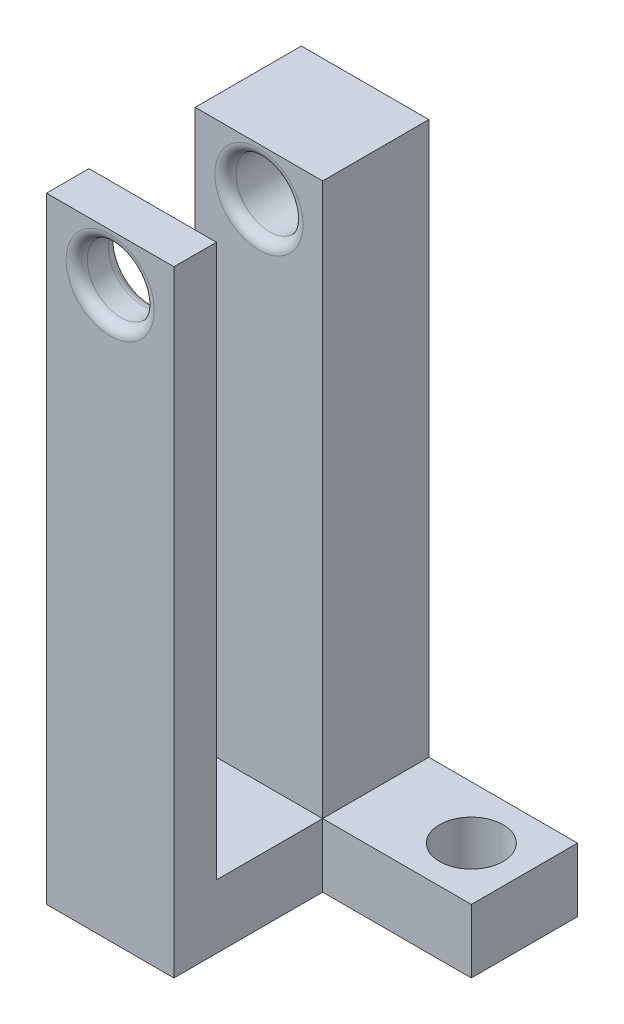
ISO-10303-21;
HEADER;
FILE_DESCRIPTION(('STEP AP214'),'2;1');
FILE_NAME('part.step','',(''),(''),'','','');
FILE_SCHEMA(('AUTOMOTIVE_DESIGN { 1 0 10303 214 1 1 1 1 }'));
ENDSEC;
DATA;
#1=APPLICATION_CONTEXT('core data for automotive mechanical design processes');
#2=APPLICATION_PROTOCOL_DEFINITION('international standard','automotive_design',2000,#1);
#3=PRODUCT_CONTEXT('',#1,'mechanical');
#4=PRODUCT('Part','Part','',(#3));
#5=PRODUCT_RELATED_PRODUCT_CATEGORY('part','',(#4));
#6=PRODUCT_DEFINITION_FORMATION('','',#4);
#7=PRODUCT_DEFINITION_CONTEXT('part definition',#1,'design');
#8=PRODUCT_DEFINITION('design','',#6,#7);
#9=PRODUCT_DEFINITION_SHAPE('','',#8);
#10=(LENGTH_UNIT() NAMED_UNIT(*) SI_UNIT(.MILLI.,.METRE.));
#11=(NAMED_UNIT(*) PLANE_ANGLE_UNIT() SI_UNIT($,.RADIAN.));
#12=(NAMED_UNIT(*) SI_UNIT($,.STERADIAN.) SOLID_ANGLE_UNIT());
#13=UNCERTAINTY_MEASURE_WITH_UNIT(LENGTH_MEASURE(1.E-05),#10,'distance_accuracy_value','');
#14=(GEOMETRIC_REPRESENTATION_CONTEXT(3) GLOBAL_UNCERTAINTY_ASSIGNED_CONTEXT((#13)) GLOBAL_UNIT_ASSIGNED_CONTEXT((#10,
#11,#12)) REPRESENTATION_CONTEXT('',''));
#15=CARTESIAN_POINT('',(0.,0.,0.));
#16=DIRECTION('',(0.,0.,1.));
#17=DIRECTION('',(1.,0.,0.));
#18=AXIS2_PLACEMENT_3D('',#15,#16,#17);
#19=CARTESIAN_POINT('',(0.,3.,0.));
#20=DIRECTION('',(0.,-1.,0.));
#21=DIRECTION('',(0.,0.,-1.));
#22=AXIS2_PLACEMENT_3D('',#19,#20,#21);
#23=PLANE('',#22);
#24=DIRECTION('',(-1.,0.,0.));
#25=VECTOR('',#24,1.);
#26=CARTESIAN_POINT('',(-3.,3.,5.92433234421365));
#27=LINE('',#26,#25);
#28=CARTESIAN_POINT('',(3.,3.,5.92433234421365));
#29=VERTEX_POINT('',#28);
#30=CARTESIAN_POINT('',(-3.,3.,5.92433234421365));
#31=VERTEX_POINT('',#30);
#32=EDGE_CURVE('E165',#29,#31,#27,.T.);
#33=ORIENTED_EDGE('',*,*,#32,.F.);
#34=DIRECTION('',(0.,0.,-1.));
#35=VECTOR('',#34,1.);
#36=CARTESIAN_POINT('',(3.,3.,0.92433234421365));
#37=LINE('',#36,#35);
#38=CARTESIAN_POINT('',(3.,3.,0.92433234421365));
#39=VERTEX_POINT('',#38);
#40=EDGE_CURVE('E247',#29,#39,#37,.T.);
#41=ORIENTED_EDGE('',*,*,#40,.T.);
#42=DIRECTION('',(1.,0.,0.));
#43=VECTOR('',#42,1.);
#44=CARTESIAN_POINT('',(-3.,3.,0.92433234421365));
#45=LINE('',#44,#43);
#46=CARTESIAN_POINT('',(-3.,3.,0.92433234421365));
#47=VERTEX_POINT('',#46);
#48=EDGE_CURVE('E198',#47,#39,#45,.T.);
#49=ORIENTED_EDGE('',*,*,#48,.F.);
#50=DIRECTION('',(0.,0.,1.));
#51=VECTOR('',#50,1.);
#52=CARTESIAN_POINT('',(-3.,3.,7.92433234421365));
#53=LINE('',#52,#51);
#54=EDGE_CURVE('E54',#47,#31,#53,.T.);
#55=ORIENTED_EDGE('',*,*,#54,.T.);
#56=EDGE_LOOP('',(#33,#41,#49,#55));
#57=FACE_BOUND('',#56,.T.);
#58=ADVANCED_FACE('F38',(#57),#23,.F.);
#59=CARTESIAN_POINT('',(-7.5,3.,-1.57566765578635));
#60=DIRECTION('',(0.,1.,0.));
#61=DIRECTION('',(0.,0.,1.));
#62=AXIS2_PLACEMENT_3D('',#59,#60,#61);
#63=CIRCLE('',#62,1.5);
#64=CARTESIAN_POINT('',(-7.5,3.,-0.0756676557863473));
#65=VERTEX_POINT('',#64);
#66=EDGE_CURVE('E221',#65,#65,#63,.T.);
#67=ORIENTED_EDGE('',*,*,#66,.F.);
#68=EDGE_LOOP('',(#67));
#69=FACE_BOUND('',#68,.T.);
#70=DIRECTION('',(0.,0.,1.));
#71=VECTOR('',#70,1.);
#72=CARTESIAN_POINT('',(-3.,3.,0.92433234421365));
#73=LINE('',#72,#71);
#74=CARTESIAN_POINT('',(-3.,3.,-4.07566765578635));
#75=VERTEX_POINT('',#74);
#76=EDGE_CURVE('E62',#75,#47,#73,.T.);
#77=ORIENTED_EDGE('',*,*,#76,.F.);
#78=DIRECTION('',(-1.,0.,0.));
#79=VECTOR('',#78,1.);
#80=CARTESIAN_POINT('',(-10.,3.,-4.07566765578635));
#81=LINE('',#80,#79);
#82=CARTESIAN_POINT('',(-10.,3.,-4.07566765578635));
#83=VERTEX_POINT('',#82);
#84=EDGE_CURVE('E256',#75,#83,#81,.T.);
#85=ORIENTED_EDGE('',*,*,#84,.T.);
#86=DIRECTION('',(0.,0.,1.));
#87=VECTOR('',#86,1.);
#88=CARTESIAN_POINT('',(-10.,3.,0.924332344213651));
#89=LINE('',#88,#87);
#90=CARTESIAN_POINT('',(-10.,3.,0.924332344213651));
#91=VERTEX_POINT('',#90);
#92=EDGE_CURVE('E237',#83,#91,#89,.T.);
#93=ORIENTED_EDGE('',*,*,#92,.T.);
#94=DIRECTION('',(1.,0.,0.));
#95=VECTOR('',#94,1.);
#96=CARTESIAN_POINT('',(-3.,3.,0.92433234421365));
#97=LINE('',#96,#95);
#98=EDGE_CURVE('E241',#91,#47,#97,.T.);
#99=ORIENTED_EDGE('',*,*,#98,.T.);
#100=EDGE_LOOP('',(#77,#85,#93,#99));
#101=FACE_BOUND('',#100,.T.);
#102=ADVANCED_FACE('F365',(#69,#101),#23,.F.);
#103=CARTESIAN_POINT('',(7.5,3.,-1.57566765578635));
#104=DIRECTION('',(0.,1.,0.));
#105=DIRECTION('',(0.,0.,1.));
#106=AXIS2_PLACEMENT_3D('',#103,#104,#105);
#107=CIRCLE('',#106,1.5);
#108=CARTESIAN_POINT('',(7.5,3.,-0.0756676557863464));
#109=VERTEX_POINT('',#108);
#110=EDGE_CURVE('E229',#109,#109,#107,.T.);
#111=ORIENTED_EDGE('',*,*,#110,.F.);
#112=EDGE_LOOP('',(#111));
#113=FACE_BOUND('',#112,.T.);
#114=DIRECTION('',(0.,0.,-1.));
#115=VECTOR('',#114,1.);
#116=CARTESIAN_POINT('',(3.,3.,0.92433234421365));
#117=LINE('',#116,#115);
#118=CARTESIAN_POINT('',(3.,3.,-4.07566765578635));
#119=VERTEX_POINT('',#118);
#120=EDGE_CURVE('E186',#39,#119,#117,.T.);
#121=ORIENTED_EDGE('',*,*,#120,.F.);
#122=DIRECTION('',(1.,0.,0.));
#123=VECTOR('',#122,1.);
#124=CARTESIAN_POINT('',(10.,3.,0.924332344213652));
#125=LINE('',#124,#123);
#126=CARTESIAN_POINT('',(10.,3.,0.924332344213652));
#127=VERTEX_POINT('',#126);
#128=EDGE_CURVE('E250',#39,#127,#125,.T.);
#129=ORIENTED_EDGE('',*,*,#128,.T.);
#130=DIRECTION('',(0.,0.,-1.));
#131=VECTOR('',#130,1.);
#132=CARTESIAN_POINT('',(10.,3.,-4.07566765578635));
#133=LINE('',#132,#131);
#134=CARTESIAN_POINT('',(10.,3.,-4.07566765578635));
#135=VERTEX_POINT('',#134);
#136=EDGE_CURVE('E253',#127,#135,#133,.T.);
#137=ORIENTED_EDGE('',*,*,#136,.T.);
#138=EDGE_CURVE('E257',#135,#119,#81,.T.);
#139=ORIENTED_EDGE('',*,*,#138,.T.);
#140=EDGE_LOOP('',(#121,#129,#137,#139));
#141=FACE_BOUND('',#140,.T.);
#142=ADVANCED_FACE('F387',(#113,#141),#23,.F.);
#143=CARTESIAN_POINT('',(0.,0.,0.));
#144=DIRECTION('',(0.,-1.,0.));
#145=DIRECTION('',(0.,0.,-1.));
#146=AXIS2_PLACEMENT_3D('',#143,#144,#145);
#147=PLANE('',#146);
#148=CARTESIAN_POINT('',(7.5,0.,-1.57566765578635));
#149=DIRECTION('',(0.,1.,0.));
#150=DIRECTION('',(0.,0.,1.));
#151=AXIS2_PLACEMENT_3D('',#148,#149,#150);
#152=CIRCLE('',#151,1.5);
#153=CARTESIAN_POINT('',(7.5,0.,-0.0756676557863464));
#154=VERTEX_POINT('',#153);
#155=EDGE_CURVE('E225',#154,#154,#152,.T.);
#156=ORIENTED_EDGE('',*,*,#155,.T.);
#157=EDGE_LOOP('',(#156));
#158=FACE_BOUND('',#157,.T.);
#159=DIRECTION('',(0.,0.,1.));
#160=VECTOR('',#159,1.);
#161=CARTESIAN_POINT('',(-10.,0.,0.924332344213651));
#162=LINE('',#161,#160);
#163=CARTESIAN_POINT('',(-10.,0.,-4.07566765578635));
#164=VERTEX_POINT('',#163);
#165=CARTESIAN_POINT('',(-10.,0.,0.924332344213651));
#166=VERTEX_POINT('',#165);
#167=EDGE_CURVE('E233',#164,#166,#162,.T.);
#168=ORIENTED_EDGE('',*,*,#167,.F.);
#169=DIRECTION('',(-1.,0.,0.));
#170=VECTOR('',#169,1.);
#171=CARTESIAN_POINT('',(-10.,0.,-4.07566765578635));
#172=LINE('',#171,#170);
#173=CARTESIAN_POINT('',(10.,0.,-4.07566765578635));
#174=VERTEX_POINT('',#173);
#175=EDGE_CURVE('E242',#174,#164,#172,.T.);
#176=ORIENTED_EDGE('',*,*,#175,.F.);
#177=DIRECTION('',(0.,0.,-1.));
#178=VECTOR('',#177,1.);
#179=CARTESIAN_POINT('',(10.,0.,-4.07566765578635));
#180=LINE('',#179,#178);
#181=CARTESIAN_POINT('',(10.,0.,0.924332344213652));
#182=VERTEX_POINT('',#181);
#183=EDGE_CURVE('E278',#182,#174,#180,.T.);
#184=ORIENTED_EDGE('',*,*,#183,.F.);
#185=DIRECTION('',(1.,0.,0.));
#186=VECTOR('',#185,1.);
#187=CARTESIAN_POINT('',(10.,0.,0.924332344213652));
#188=LINE('',#187,#186);
#189=CARTESIAN_POINT('',(3.,0.,0.92433234421365));
#190=VERTEX_POINT('',#189);
#191=EDGE_CURVE('E275',#190,#182,#188,.T.);
#192=ORIENTED_EDGE('',*,*,#191,.F.);
#193=DIRECTION('',(0.,0.,-1.));
#194=VECTOR('',#193,1.);
#195=CARTESIAN_POINT('',(3.,0.,0.92433234421365));
#196=LINE('',#195,#194);
#197=CARTESIAN_POINT('',(3.,0.,7.92433234421365));
#198=VERTEX_POINT('',#197);
#199=EDGE_CURVE('E272',#198,#190,#196,.T.);
#200=ORIENTED_EDGE('',*,*,#199,.F.);
#201=DIRECTION('',(1.,0.,0.));
#202=VECTOR('',#201,1.);
#203=CARTESIAN_POINT('',(3.,0.,7.92433234421365));
#204=LINE('',#203,#202);
#205=CARTESIAN_POINT('',(-3.,0.,7.92433234421365));
#206=VERTEX_POINT('',#205);
#207=EDGE_CURVE('E269',#206,#198,#204,.T.);
#208=ORIENTED_EDGE('',*,*,#207,.F.);
#209=DIRECTION('',(0.,0.,1.));
#210=VECTOR('',#209,1.);
#211=CARTESIAN_POINT('',(-3.,0.,7.92433234421365));
#212=LINE('',#211,#210);
#213=CARTESIAN_POINT('',(-3.,0.,0.92433234421365));
#214=VERTEX_POINT('',#213);
#215=EDGE_CURVE('E144',#214,#206,#212,.T.);
#216=ORIENTED_EDGE('',*,*,#215,.F.);
#217=DIRECTION('',(1.,0.,0.));
#218=VECTOR('',#217,1.);
#219=CARTESIAN_POINT('',(-3.,0.,0.92433234421365));
#220=LINE('',#219,#218);
#221=EDGE_CURVE('E264',#166,#214,#220,.T.);
#222=ORIENTED_EDGE('',*,*,#221,.F.);
#223=EDGE_LOOP('',(#168,#176,#184,#192,#200,#208,#216,#222));
#224=FACE_BOUND('',#223,.T.);
#225=CARTESIAN_POINT('',(-7.5,0.,-1.57566765578635));
#226=DIRECTION('',(0.,1.,0.));
#227=DIRECTION('',(0.,0.,1.));
#228=AXIS2_PLACEMENT_3D('',#225,#226,#227);
#229=CIRCLE('',#228,1.5);
#230=CARTESIAN_POINT('',(-7.5,0.,-0.0756676557863473));
#231=VERTEX_POINT('',#230);
#232=EDGE_CURVE('E220',#231,#231,#229,.T.);
#233=ORIENTED_EDGE('',*,*,#232,.T.);
#234=EDGE_LOOP('',(#233));
#235=FACE_BOUND('',#234,.T.);
#236=ADVANCED_FACE('F394',(#158,#224,#235),#147,.T.);
#237=CARTESIAN_POINT('',(-10.,3.,0.924332344213651));
#238=DIRECTION('',(1.,0.,0.));
#239=DIRECTION('',(0.,0.,-1.));
#240=AXIS2_PLACEMENT_3D('',#237,#238,#239);
#241=PLANE('',#240);
#242=ORIENTED_EDGE('',*,*,#167,.T.);
#243=DIRECTION('',(0.,-1.,0.));
#244=VECTOR('',#243,1.);
#245=CARTESIAN_POINT('',(-10.,3.,0.924332344213651));
#246=LINE('',#245,#244);
#247=EDGE_CURVE('E302',#91,#166,#246,.T.);
#248=ORIENTED_EDGE('',*,*,#247,.F.);
#249=ORIENTED_EDGE('',*,*,#92,.F.);
#250=DIRECTION('',(0.,-1.,0.));
#251=VECTOR('',#250,1.);
#252=CARTESIAN_POINT('',(-10.,3.,-4.07566765578635));
#253=LINE('',#252,#251);
#254=EDGE_CURVE('E260',#83,#164,#253,.T.);
#255=ORIENTED_EDGE('',*,*,#254,.T.);
#256=EDGE_LOOP('',(#242,#248,#249,#255));
#257=FACE_BOUND('',#256,.T.);
#258=ADVANCED_FACE('F369',(#257),#241,.F.);
#259=CARTESIAN_POINT('',(-3.,3.,0.92433234421365));
#260=DIRECTION('',(0.,0.,-1.));
#261=DIRECTION('',(-1.,0.,0.));
#262=AXIS2_PLACEMENT_3D('',#259,#260,#261);
#263=PLANE('',#262);
#264=ORIENTED_EDGE('',*,*,#221,.T.);
#265=DIRECTION('',(0.,-1.,0.));
#266=VECTOR('',#265,1.);
#267=CARTESIAN_POINT('',(-3.,3.,0.92433234421365));
#268=LINE('',#267,#266);
#269=EDGE_CURVE('E148',#47,#214,#268,.T.);
#270=ORIENTED_EDGE('',*,*,#269,.F.);
#271=ORIENTED_EDGE('',*,*,#98,.F.);
#272=ORIENTED_EDGE('',*,*,#247,.T.);
#273=EDGE_LOOP('',(#264,#270,#271,#272));
#274=FACE_BOUND('',#273,.T.);
#275=ADVANCED_FACE('F372',(#274),#263,.F.);
#276=CARTESIAN_POINT('',(-3.,3.,7.92433234421365));
#277=DIRECTION('',(1.,0.,0.));
#278=DIRECTION('',(0.,0.,-1.));
#279=AXIS2_PLACEMENT_3D('',#276,#277,#278);
#280=PLANE('',#279);
#281=ORIENTED_EDGE('',*,*,#215,.T.);
#282=DIRECTION('',(0.,-1.,0.));
#283=VECTOR('',#282,1.);
#284=CARTESIAN_POINT('',(-3.,3.,7.92433234421365));
#285=LINE('',#284,#283);
#286=CARTESIAN_POINT('',(-3.,29.,7.92433234421365));
#287=VERTEX_POINT('',#286);
#288=EDGE_CURVE('E136',#287,#206,#285,.T.);
#289=ORIENTED_EDGE('',*,*,#288,.F.);
#290=DIRECTION('',(0.,0.,1.));
#291=VECTOR('',#290,1.);
#292=CARTESIAN_POINT('',(-3.,29.,7.92433234421365));
#293=LINE('',#292,#291);
#294=CARTESIAN_POINT('',(-3.,29.,5.92433234421365));
#295=VERTEX_POINT('',#294);
#296=EDGE_CURVE('E141',#295,#287,#293,.T.);
#297=ORIENTED_EDGE('',*,*,#296,.F.);
#298=DIRECTION('',(0.,-1.,0.));
#299=VECTOR('',#298,1.);
#300=CARTESIAN_POINT('',(-3.,29.,5.92433234421365));
#301=LINE('',#300,#299);
#302=EDGE_CURVE('E173',#295,#31,#301,.T.);
#303=ORIENTED_EDGE('',*,*,#302,.T.);
#304=ORIENTED_EDGE('',*,*,#54,.F.);
#305=ORIENTED_EDGE('',*,*,#269,.T.);
#306=EDGE_LOOP('',(#281,#289,#297,#303,#304,#305));
#307=FACE_BOUND('',#306,.T.);
#308=ADVANCED_FACE('F138',(#307),#280,.F.);
#309=CARTESIAN_POINT('',(3.,3.,7.92433234421365));
#310=DIRECTION('',(0.,0.,-1.));
#311=DIRECTION('',(-1.,0.,0.));
#312=AXIS2_PLACEMENT_3D('',#309,#310,#311);
#313=PLANE('',#312);
#314=CARTESIAN_POINT('',(0.,26.75,7.92433234421365));
#315=DIRECTION('',(0.,0.,-1.));
#316=DIRECTION('',(-1.,0.,0.));
#317=AXIS2_PLACEMENT_3D('',#314,#315,#316);
#318=CIRCLE('',#317,2.075);
#319=CARTESIAN_POINT('',(-2.075,26.75,7.92433234421365));
#320=VERTEX_POINT('',#319);
#321=EDGE_CURVE('E318',#320,#320,#318,.T.);
#322=ORIENTED_EDGE('',*,*,#321,.T.);
#323=EDGE_LOOP('',(#322));
#324=FACE_BOUND('',#323,.T.);
#325=ORIENTED_EDGE('',*,*,#207,.T.);
#326=DIRECTION('',(0.,-1.,0.));
#327=VECTOR('',#326,1.);
#328=CARTESIAN_POINT('',(3.,3.,7.92433234421365));
#329=LINE('',#328,#327);
#330=CARTESIAN_POINT('',(3.,29.,7.92433234421365));
#331=VERTEX_POINT('',#330);
#332=EDGE_CURVE('E149',#331,#198,#329,.T.);
#333=ORIENTED_EDGE('',*,*,#332,.F.);
#334=DIRECTION('',(1.,0.,0.));
#335=VECTOR('',#334,1.);
#336=CARTESIAN_POINT('',(-3.,29.,7.92433234421365));
#337=LINE('',#336,#335);
#338=EDGE_CURVE('E152',#287,#331,#337,.T.);
#339=ORIENTED_EDGE('',*,*,#338,.F.);
#340=ORIENTED_EDGE('',*,*,#288,.T.);
#341=EDGE_LOOP('',(#325,#333,#339,#340));
#342=FACE_BOUND('',#341,.T.);
#343=ADVANCED_FACE('F153',(#324,#342),#313,.F.);
#344=CARTESIAN_POINT('',(3.,3.,0.92433234421365));
#345=DIRECTION('',(-1.,0.,0.));
#346=DIRECTION('',(0.,0.,1.));
#347=AXIS2_PLACEMENT_3D('',#344,#345,#346);
#348=PLANE('',#347);
#349=ORIENTED_EDGE('',*,*,#199,.T.);
#350=DIRECTION('',(0.,-1.,0.));
#351=VECTOR('',#350,1.);
#352=CARTESIAN_POINT('',(3.,3.,0.92433234421365));
#353=LINE('',#352,#351);
#354=EDGE_CURVE('E294',#39,#190,#353,.T.);
#355=ORIENTED_EDGE('',*,*,#354,.F.);
#356=ORIENTED_EDGE('',*,*,#40,.F.);
#357=DIRECTION('',(0.,-1.,0.));
#358=VECTOR('',#357,1.);
#359=CARTESIAN_POINT('',(3.,29.,5.92433234421365));
#360=LINE('',#359,#358);
#361=CARTESIAN_POINT('',(3.,29.,5.92433234421365));
#362=VERTEX_POINT('',#361);
#363=EDGE_CURVE('E177',#362,#29,#360,.T.);
#364=ORIENTED_EDGE('',*,*,#363,.F.);
#365=DIRECTION('',(0.,0.,-1.));
#366=VECTOR('',#365,1.);
#367=CARTESIAN_POINT('',(3.,29.,7.92433234421365));
#368=LINE('',#367,#366);
#369=EDGE_CURVE('E158',#331,#362,#368,.T.);
#370=ORIENTED_EDGE('',*,*,#369,.F.);
#371=ORIENTED_EDGE('',*,*,#332,.T.);
#372=EDGE_LOOP('',(#349,#355,#356,#364,#370,#371));
#373=FACE_BOUND('',#372,.T.);
#374=ADVANCED_FACE('F385',(#373),#348,.F.);
#375=CARTESIAN_POINT('',(10.,3.,0.924332344213652));
#376=DIRECTION('',(0.,0.,-1.));
#377=DIRECTION('',(-1.,0.,0.));
#378=AXIS2_PLACEMENT_3D('',#375,#376,#377);
#379=PLANE('',#378);
#380=ORIENTED_EDGE('',*,*,#191,.T.);
#381=DIRECTION('',(0.,-1.,0.));
#382=VECTOR('',#381,1.);
#383=CARTESIAN_POINT('',(10.,3.,0.924332344213652));
#384=LINE('',#383,#382);
#385=EDGE_CURVE('E290',#127,#182,#384,.T.);
#386=ORIENTED_EDGE('',*,*,#385,.F.);
#387=ORIENTED_EDGE('',*,*,#128,.F.);
#388=ORIENTED_EDGE('',*,*,#354,.T.);
#389=EDGE_LOOP('',(#380,#386,#387,#388));
#390=FACE_BOUND('',#389,.T.);
#391=ADVANCED_FACE('F381',(#390),#379,.F.);
#392=CARTESIAN_POINT('',(10.,3.,-4.07566765578635));
#393=DIRECTION('',(-1.,0.,0.));
#394=DIRECTION('',(0.,0.,1.));
#395=AXIS2_PLACEMENT_3D('',#392,#393,#394);
#396=PLANE('',#395);
#397=ORIENTED_EDGE('',*,*,#183,.T.);
#398=DIRECTION('',(0.,-1.,0.));
#399=VECTOR('',#398,1.);
#400=CARTESIAN_POINT('',(10.,3.,-4.07566765578635));
#401=LINE('',#400,#399);
#402=EDGE_CURVE('E286',#135,#174,#401,.T.);
#403=ORIENTED_EDGE('',*,*,#402,.F.);
#404=ORIENTED_EDGE('',*,*,#136,.F.);
#405=ORIENTED_EDGE('',*,*,#385,.T.);
#406=EDGE_LOOP('',(#397,#403,#404,#405));
#407=FACE_BOUND('',#406,.T.);
#408=ADVANCED_FACE('F396',(#407),#396,.F.);
#409=CARTESIAN_POINT('',(-10.,3.,-4.07566765578635));
#410=DIRECTION('',(0.,0.,1.));
#411=DIRECTION('',(1.,0.,0.));
#412=AXIS2_PLACEMENT_3D('',#409,#410,#411);
#413=PLANE('',#412);
#414=CARTESIAN_POINT('',(0.,26.75,-4.07566765578635));
#415=DIRECTION('',(0.,0.,1.));
#416=DIRECTION('',(1.,0.,0.));
#417=AXIS2_PLACEMENT_3D('',#414,#415,#416);
#418=CIRCLE('',#417,2.075);
#419=CARTESIAN_POINT('',(2.075,26.75,-4.07566765578635));
#420=VERTEX_POINT('',#419);
#421=EDGE_CURVE('E11',#420,#420,#418,.T.);
#422=ORIENTED_EDGE('',*,*,#421,.T.);
#423=EDGE_LOOP('',(#422));
#424=FACE_BOUND('',#423,.T.);
#425=ORIENTED_EDGE('',*,*,#175,.T.);
#426=ORIENTED_EDGE('',*,*,#254,.F.);
#427=ORIENTED_EDGE('',*,*,#84,.F.);
#428=DIRECTION('',(0.,-1.,0.));
#429=VECTOR('',#428,1.);
#430=CARTESIAN_POINT('',(-3.,29.,-4.07566765578635));
#431=LINE('',#430,#429);
#432=CARTESIAN_POINT('',(-3.,29.,-4.07566765578635));
#433=VERTEX_POINT('',#432);
#434=EDGE_CURVE('E195',#433,#75,#431,.T.);
#435=ORIENTED_EDGE('',*,*,#434,.F.);
#436=DIRECTION('',(-1.,0.,0.));
#437=VECTOR('',#436,1.);
#438=CARTESIAN_POINT('',(-3.,29.,-4.07566765578635));
#439=LINE('',#438,#437);
#440=CARTESIAN_POINT('',(3.,29.,-4.07566765578635));
#441=VERTEX_POINT('',#440);
#442=EDGE_CURVE('E192',#441,#433,#439,.T.);
#443=ORIENTED_EDGE('',*,*,#442,.F.);
#444=DIRECTION('',(0.,-1.,0.));
#445=VECTOR('',#444,1.);
#446=CARTESIAN_POINT('',(3.,29.,-4.07566765578635));
#447=LINE('',#446,#445);
#448=EDGE_CURVE('E208',#441,#119,#447,.T.);
#449=ORIENTED_EDGE('',*,*,#448,.T.);
#450=ORIENTED_EDGE('',*,*,#138,.F.);
#451=ORIENTED_EDGE('',*,*,#402,.T.);
#452=EDGE_LOOP('',(#425,#426,#427,#435,#443,#449,#450,#451));
#453=FACE_BOUND('',#452,.T.);
#454=ADVANCED_FACE('F361',(#424,#453),#413,.F.);
#455=CARTESIAN_POINT('',(7.5,3.,-1.57566765578635));
#456=DIRECTION('',(0.,-1.,0.));
#457=DIRECTION('',(0.,0.,-1.));
#458=AXIS2_PLACEMENT_3D('',#455,#456,#457);
#459=CYLINDRICAL_SURFACE('',#458,1.5);
#460=ORIENTED_EDGE('',*,*,#110,.T.);
#461=EDGE_LOOP('',(#460));
#462=FACE_BOUND('',#461,.T.);
#463=ORIENTED_EDGE('',*,*,#155,.F.);
#464=EDGE_LOOP('',(#463));
#465=FACE_BOUND('',#464,.T.);
#466=ADVANCED_FACE('F404',(#462,#465),#459,.F.);
#467=CARTESIAN_POINT('',(-7.5,3.,-1.57566765578635));
#468=DIRECTION('',(0.,-1.,0.));
#469=DIRECTION('',(0.,0.,-1.));
#470=AXIS2_PLACEMENT_3D('',#467,#468,#469);
#471=CYLINDRICAL_SURFACE('',#470,1.5);
#472=ORIENTED_EDGE('',*,*,#66,.T.);
#473=EDGE_LOOP('',(#472));
#474=FACE_BOUND('',#473,.T.);
#475=ORIENTED_EDGE('',*,*,#232,.F.);
#476=EDGE_LOOP('',(#475));
#477=FACE_BOUND('',#476,.T.);
#478=ADVANCED_FACE('F426',(#474,#477),#471,.F.);
#479=CARTESIAN_POINT('',(-3.,29.,0.92433234421365));
#480=DIRECTION('',(1.,0.,0.));
#481=DIRECTION('',(0.,0.,-1.));
#482=AXIS2_PLACEMENT_3D('',#479,#480,#481);
#483=PLANE('',#482);
#484=ORIENTED_EDGE('',*,*,#76,.T.);
#485=DIRECTION('',(0.,-1.,0.));
#486=VECTOR('',#485,1.);
#487=CARTESIAN_POINT('',(-3.,29.,0.92433234421365));
#488=LINE('',#487,#486);
#489=CARTESIAN_POINT('',(-3.,29.,0.92433234421365));
#490=VERTEX_POINT('',#489);
#491=EDGE_CURVE('E216',#490,#47,#488,.T.);
#492=ORIENTED_EDGE('',*,*,#491,.F.);
#493=DIRECTION('',(0.,0.,1.));
#494=VECTOR('',#493,1.);
#495=CARTESIAN_POINT('',(-3.,29.,0.92433234421365));
#496=LINE('',#495,#494);
#497=EDGE_CURVE('E181',#433,#490,#496,.T.);
#498=ORIENTED_EDGE('',*,*,#497,.F.);
#499=ORIENTED_EDGE('',*,*,#434,.T.);
#500=EDGE_LOOP('',(#484,#492,#498,#499));
#501=FACE_BOUND('',#500,.T.);
#502=ADVANCED_FACE('F346',(#501),#483,.F.);
#503=CARTESIAN_POINT('',(-3.,29.,0.92433234421365));
#504=DIRECTION('',(0.,0.,-1.));
#505=DIRECTION('',(-1.,0.,0.));
#506=AXIS2_PLACEMENT_3D('',#503,#504,#505);
#507=PLANE('',#506);
#508=CARTESIAN_POINT('',(0.,26.75,0.92433234421365));
#509=DIRECTION('',(0.,0.,-1.));
#510=DIRECTION('',(-1.,0.,0.));
#511=AXIS2_PLACEMENT_3D('',#508,#509,#510);
#512=CIRCLE('',#511,2.075);
#513=CARTESIAN_POINT('',(-2.075,26.75,0.92433234421365));
#514=VERTEX_POINT('',#513);
#515=EDGE_CURVE('E322',#514,#514,#512,.T.);
#516=ORIENTED_EDGE('',*,*,#515,.T.);
#517=EDGE_LOOP('',(#516));
#518=FACE_BOUND('',#517,.T.);
#519=ORIENTED_EDGE('',*,*,#48,.T.);
#520=DIRECTION('',(0.,-1.,0.));
#521=VECTOR('',#520,1.);
#522=CARTESIAN_POINT('',(3.,29.,0.92433234421365));
#523=LINE('',#522,#521);
#524=CARTESIAN_POINT('',(3.,29.,0.92433234421365));
#525=VERTEX_POINT('',#524);
#526=EDGE_CURVE('E212',#525,#39,#523,.T.);
#527=ORIENTED_EDGE('',*,*,#526,.F.);
#528=DIRECTION('',(1.,0.,0.));
#529=VECTOR('',#528,1.);
#530=CARTESIAN_POINT('',(-3.,29.,0.92433234421365));
#531=LINE('',#530,#529);
#532=EDGE_CURVE('E185',#490,#525,#531,.T.);
#533=ORIENTED_EDGE('',*,*,#532,.F.);
#534=ORIENTED_EDGE('',*,*,#491,.T.);
#535=EDGE_LOOP('',(#519,#527,#533,#534));
#536=FACE_BOUND('',#535,.T.);
#537=ADVANCED_FACE('F342',(#518,#536),#507,.F.);
#538=CARTESIAN_POINT('',(3.,29.,0.92433234421365));
#539=DIRECTION('',(-1.,0.,0.));
#540=DIRECTION('',(0.,0.,1.));
#541=AXIS2_PLACEMENT_3D('',#538,#539,#540);
#542=PLANE('',#541);
#543=ORIENTED_EDGE('',*,*,#120,.T.);
#544=ORIENTED_EDGE('',*,*,#448,.F.);
#545=DIRECTION('',(0.,0.,-1.));
#546=VECTOR('',#545,1.);
#547=CARTESIAN_POINT('',(3.,29.,0.92433234421365));
#548=LINE('',#547,#546);
#549=EDGE_CURVE('E189',#525,#441,#548,.T.);
#550=ORIENTED_EDGE('',*,*,#549,.F.);
#551=ORIENTED_EDGE('',*,*,#526,.T.);
#552=EDGE_LOOP('',(#543,#544,#550,#551));
#553=FACE_BOUND('',#552,.T.);
#554=ADVANCED_FACE('F345',(#553),#542,.F.);
#555=CARTESIAN_POINT('',(0.,29.,0.));
#556=DIRECTION('',(0.,-1.,0.));
#557=DIRECTION('',(0.,0.,-1.));
#558=AXIS2_PLACEMENT_3D('',#555,#556,#557);
#559=PLANE('',#558);
#560=ORIENTED_EDGE('',*,*,#497,.T.);
#561=ORIENTED_EDGE('',*,*,#532,.T.);
#562=ORIENTED_EDGE('',*,*,#549,.T.);
#563=ORIENTED_EDGE('',*,*,#442,.T.);
#564=EDGE_LOOP('',(#560,#561,#562,#563));
#565=FACE_BOUND('',#564,.T.);
#566=ADVANCED_FACE('F356',(#565),#559,.F.);
#567=CARTESIAN_POINT('',(-3.,29.,5.92433234421365));
#568=DIRECTION('',(0.,0.,1.));
#569=DIRECTION('',(1.,0.,0.));
#570=AXIS2_PLACEMENT_3D('',#567,#568,#569);
#571=PLANE('',#570);
#572=CARTESIAN_POINT('',(0.,26.75,5.92433234421365));
#573=DIRECTION('',(0.,0.,1.));
#574=DIRECTION('',(1.,0.,0.));
#575=AXIS2_PLACEMENT_3D('',#572,#573,#574);
#576=CIRCLE('',#575,2.075);
#577=CARTESIAN_POINT('',(2.075,26.75,5.92433234421365));
#578=VERTEX_POINT('',#577);
#579=EDGE_CURVE('E306',#578,#578,#576,.T.);
#580=ORIENTED_EDGE('',*,*,#579,.T.);
#581=EDGE_LOOP('',(#580));
#582=FACE_BOUND('',#581,.T.);
#583=ORIENTED_EDGE('',*,*,#32,.T.);
#584=ORIENTED_EDGE('',*,*,#302,.F.);
#585=DIRECTION('',(-1.,0.,0.));
#586=VECTOR('',#585,1.);
#587=CARTESIAN_POINT('',(-3.,29.,5.92433234421365));
#588=LINE('',#587,#586);
#589=EDGE_CURVE('E162',#362,#295,#588,.T.);
#590=ORIENTED_EDGE('',*,*,#589,.F.);
#591=ORIENTED_EDGE('',*,*,#363,.T.);
#592=EDGE_LOOP('',(#583,#584,#590,#591));
#593=FACE_BOUND('',#592,.T.);
#594=ADVANCED_FACE('F374',(#582,#593),#571,.F.);
#595=CARTESIAN_POINT('',(0.,29.,0.));
#596=DIRECTION('',(0.,-1.,0.));
#597=DIRECTION('',(0.,0.,-1.));
#598=AXIS2_PLACEMENT_3D('',#595,#596,#597);
#599=PLANE('',#598);
#600=ORIENTED_EDGE('',*,*,#296,.T.);
#601=ORIENTED_EDGE('',*,*,#338,.T.);
#602=ORIENTED_EDGE('',*,*,#369,.T.);
#603=ORIENTED_EDGE('',*,*,#589,.T.);
#604=EDGE_LOOP('',(#600,#601,#602,#603));
#605=FACE_BOUND('',#604,.T.);
#606=ADVANCED_FACE('F160',(#605),#599,.F.);
#607=CARTESIAN_POINT('',(0.,26.75,12.3791050656889));
#608=DIRECTION('',(0.,0.,-1.));
#609=DIRECTION('',(-1.,0.,0.));
#610=AXIS2_PLACEMENT_3D('',#607,#608,#609);
#611=CYLINDRICAL_SURFACE('',#610,1.575);
#612=CARTESIAN_POINT('',(0.,26.75,6.42433234421365));
#613=DIRECTION('',(0.,0.,1.));
#614=DIRECTION('',(1.,0.,0.));
#615=AXIS2_PLACEMENT_3D('',#612,#613,#614);
#616=CIRCLE('',#615,1.575);
#617=CARTESIAN_POINT('',(1.575,26.75,6.42433234421365));
#618=VERTEX_POINT('',#617);
#619=EDGE_CURVE('E314',#618,#618,#616,.F.);
#620=ORIENTED_EDGE('',*,*,#619,.T.);
#621=EDGE_LOOP('',(#620));
#622=FACE_BOUND('',#621,.T.);
#623=CARTESIAN_POINT('',(0.,26.75,7.42433234421365));
#624=DIRECTION('',(0.,0.,-1.));
#625=DIRECTION('',(-1.,0.,0.));
#626=AXIS2_PLACEMENT_3D('',#623,#624,#625);
#627=CIRCLE('',#626,1.575);
#628=CARTESIAN_POINT('',(-1.575,26.75,7.42433234421365));
#629=VERTEX_POINT('',#628);
#630=EDGE_CURVE('E310',#629,#629,#627,.F.);
#631=ORIENTED_EDGE('',*,*,#630,.T.);
#632=EDGE_LOOP('',(#631));
#633=FACE_BOUND('',#632,.T.);
#634=ADVANCED_FACE('F445',(#622,#633),#611,.F.);
#635=CARTESIAN_POINT('',(0.,26.75,0.42433234421365));
#636=DIRECTION('',(0.,0.,-1.));
#637=DIRECTION('',(-1.,0.,0.));
#638=AXIS2_PLACEMENT_3D('',#635,#636,#637);
#639=CIRCLE('',#638,1.575);
#640=CARTESIAN_POINT('',(-1.575,26.75,0.42433234421365));
#641=VERTEX_POINT('',#640);
#642=EDGE_CURVE('E47',#641,#641,#639,.F.);
#643=ORIENTED_EDGE('',*,*,#642,.T.);
#644=EDGE_LOOP('',(#643));
#645=FACE_BOUND('',#644,.T.);
#646=CARTESIAN_POINT('',(0.,26.75,-3.57566765578635));
#647=DIRECTION('',(0.,0.,1.));
#648=DIRECTION('',(1.,0.,0.));
#649=AXIS2_PLACEMENT_3D('',#646,#647,#648);
#650=CIRCLE('',#649,1.575);
#651=CARTESIAN_POINT('',(1.575,26.75,-3.57566765578635));
#652=VERTEX_POINT('',#651);
#653=EDGE_CURVE('E326',#652,#652,#650,.F.);
#654=ORIENTED_EDGE('',*,*,#653,.T.);
#655=EDGE_LOOP('',(#654));
#656=FACE_BOUND('',#655,.T.);
#657=ADVANCED_FACE('F333',(#645,#656),#611,.F.);
#658=CARTESIAN_POINT('',(0.,26.75,6.42433234421365));
#659=DIRECTION('',(0.,0.,1.));
#660=DIRECTION('',(1.,0.,0.));
#661=AXIS2_PLACEMENT_3D('',#658,#659,#660);
#662=TOROIDAL_SURFACE('',#661,2.075,0.5);
#663=ORIENTED_EDGE('',*,*,#619,.F.);
#664=EDGE_LOOP('',(#663));
#665=FACE_BOUND('',#664,.T.);
#666=ORIENTED_EDGE('',*,*,#579,.F.);
#667=EDGE_LOOP('',(#666));
#668=FACE_BOUND('',#667,.T.);
#669=ADVANCED_FACE('F447',(#665,#668),#662,.T.);
#670=CARTESIAN_POINT('',(0.,26.75,7.42433234421365));
#671=DIRECTION('',(0.,0.,-1.));
#672=DIRECTION('',(-1.,0.,0.));
#673=AXIS2_PLACEMENT_3D('',#670,#671,#672);
#674=TOROIDAL_SURFACE('',#673,2.075,0.5);
#675=ORIENTED_EDGE('',*,*,#321,.F.);
#676=EDGE_LOOP('',(#675));
#677=FACE_BOUND('',#676,.T.);
#678=ORIENTED_EDGE('',*,*,#630,.F.);
#679=EDGE_LOOP('',(#678));
#680=FACE_BOUND('',#679,.T.);
#681=ADVANCED_FACE('F339',(#677,#680),#674,.T.);
#682=CARTESIAN_POINT('',(0.,26.75,0.42433234421365));
#683=DIRECTION('',(0.,0.,-1.));
#684=DIRECTION('',(-1.,0.,0.));
#685=AXIS2_PLACEMENT_3D('',#682,#683,#684);
#686=TOROIDAL_SURFACE('',#685,2.075,0.5);
#687=ORIENTED_EDGE('',*,*,#642,.F.);
#688=EDGE_LOOP('',(#687));
#689=FACE_BOUND('',#688,.T.);
#690=ORIENTED_EDGE('',*,*,#515,.F.);
#691=EDGE_LOOP('',(#690));
#692=FACE_BOUND('',#691,.T.);
#693=ADVANCED_FACE('F336',(#689,#692),#686,.T.);
#694=CARTESIAN_POINT('',(0.,26.75,-3.57566765578635));
#695=DIRECTION('',(0.,0.,1.));
#696=DIRECTION('',(1.,0.,0.));
#697=AXIS2_PLACEMENT_3D('',#694,#695,#696);
#698=TOROIDAL_SURFACE('',#697,2.075,0.5);
#699=ORIENTED_EDGE('',*,*,#421,.F.);
#700=EDGE_LOOP('',(#699));
#701=FACE_BOUND('',#700,.T.);
#702=ORIENTED_EDGE('',*,*,#653,.F.);
#703=EDGE_LOOP('',(#702));
#704=FACE_BOUND('',#703,.T.);
#705=ADVANCED_FACE('F40',(#701,#704),#698,.T.);
#706=CLOSED_SHELL('',(#58,#102,#142,#236,#258,#275,#308,#343,#374,#391,#408,#454,#466,#478,#502,
#537,#554,#566,#594,#606,#634,#657,#669,#681,#693,#705));
#707=MANIFOLD_SOLID_BREP('B2',#706);
#708=ADVANCED_BREP_SHAPE_REPRESENTATION('',(#18,#707),#14);
#709=SHAPE_DEFINITION_REPRESENTATION(#9,#708);
ENDSEC;
END-ISO-10303-21;
